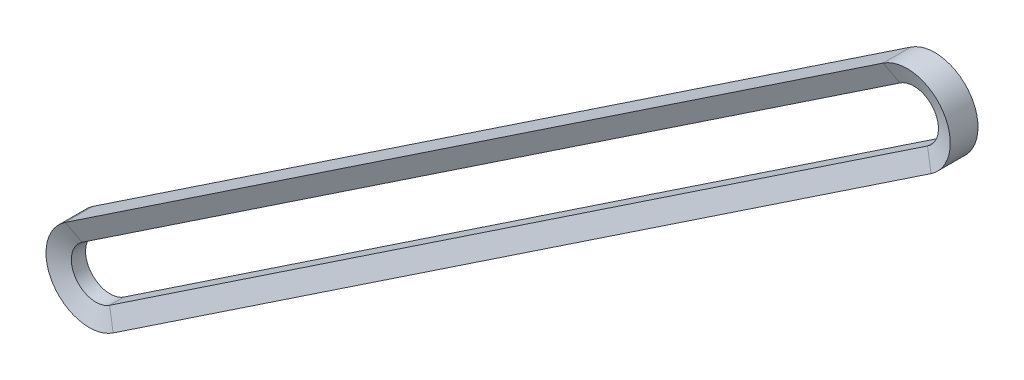
ISO-10303-21;
HEADER;
FILE_DESCRIPTION(('STEP AP214'),'2;1');
FILE_NAME('part.step','',(''),(''),'','','');
FILE_SCHEMA(('AUTOMOTIVE_DESIGN { 1 0 10303 214 1 1 1 1 }'));
ENDSEC;
DATA;
#1=APPLICATION_CONTEXT('core data for automotive mechanical design processes');
#2=APPLICATION_PROTOCOL_DEFINITION('international standard','automotive_design',2000,#1);
#3=PRODUCT_CONTEXT('',#1,'mechanical');
#4=PRODUCT('Part','Part','',(#3));
#5=PRODUCT_RELATED_PRODUCT_CATEGORY('part','',(#4));
#6=PRODUCT_DEFINITION_FORMATION('','',#4);
#7=PRODUCT_DEFINITION_CONTEXT('part definition',#1,'design');
#8=PRODUCT_DEFINITION('design','',#6,#7);
#9=PRODUCT_DEFINITION_SHAPE('','',#8);
#10=(LENGTH_UNIT() NAMED_UNIT(*) SI_UNIT(.MILLI.,.METRE.));
#11=(NAMED_UNIT(*) PLANE_ANGLE_UNIT() SI_UNIT($,.RADIAN.));
#12=(NAMED_UNIT(*) SI_UNIT($,.STERADIAN.) SOLID_ANGLE_UNIT());
#13=UNCERTAINTY_MEASURE_WITH_UNIT(LENGTH_MEASURE(1.E-05),#10,'distance_accuracy_value','');
#14=(GEOMETRIC_REPRESENTATION_CONTEXT(3) GLOBAL_UNCERTAINTY_ASSIGNED_CONTEXT((#13)) GLOBAL_UNIT_ASSIGNED_CONTEXT((#10,
#11,#12)) REPRESENTATION_CONTEXT('',''));
#15=CARTESIAN_POINT('',(0.,0.,0.));
#16=DIRECTION('',(0.,0.,1.));
#17=DIRECTION('',(1.,0.,0.));
#18=AXIS2_PLACEMENT_3D('',#15,#16,#17);
#19=CARTESIAN_POINT('',(6.63168225572308,4.4345393959262,0.));
#20=DIRECTION('',(0.,0.,1.));
#21=DIRECTION('',(1.,0.,0.));
#22=AXIS2_PLACEMENT_3D('',#19,#20,#21);
#23=CYLINDRICAL_SURFACE('',#22,5.3);
#24=CARTESIAN_POINT('',(6.63168225572308,4.4345393959262,-1.535));
#25=DIRECTION('',(0.,0.,1.));
#26=DIRECTION('',(0.555864056622764,-0.831273210536034,0.));
#27=AXIS2_PLACEMENT_3D('',#24,#25,#26);
#28=CIRCLE('',#27,5.3);
#29=CARTESIAN_POINT('',(9.57776175582378,0.0287913800852552,-1.535));
#30=VERTEX_POINT('',#29);
#31=CARTESIAN_POINT('',(3.68560275562248,8.84028741176721,-1.535));
#32=VERTEX_POINT('',#31);
#33=EDGE_CURVE('E11',#30,#32,#28,.T.);
#34=ORIENTED_EDGE('',*,*,#33,.F.);
#35=DIRECTION('',(0.,0.,-1.));
#36=VECTOR('',#35,1.);
#37=CARTESIAN_POINT('',(9.57776175582373,0.0287913800852135,1.535));
#38=LINE('',#37,#36);
#39=CARTESIAN_POINT('',(9.57776175582378,0.0287913800852552,1.535));
#40=VERTEX_POINT('',#39);
#41=EDGE_CURVE('E44',#30,#40,#38,.F.);
#42=ORIENTED_EDGE('',*,*,#41,.T.);
#43=CARTESIAN_POINT('',(6.63168225572308,4.4345393959262,1.535));
#44=DIRECTION('',(0.,0.,1.));
#45=DIRECTION('',(0.555864056622764,-0.831273210536034,0.));
#46=AXIS2_PLACEMENT_3D('',#43,#44,#45);
#47=CIRCLE('',#46,5.3);
#48=CARTESIAN_POINT('',(3.68560275562248,8.84028741176721,1.535));
#49=VERTEX_POINT('',#48);
#50=EDGE_CURVE('E129',#40,#49,#47,.T.);
#51=ORIENTED_EDGE('',*,*,#50,.T.);
#52=DIRECTION('',(0.,0.,-1.));
#53=VECTOR('',#52,1.);
#54=CARTESIAN_POINT('',(3.68560275562248,8.84028741176721,1.535));
#55=LINE('',#54,#53);
#56=EDGE_CURVE('E132',#32,#49,#55,.F.);
#57=ORIENTED_EDGE('',*,*,#56,.F.);
#58=EDGE_LOOP('',(#34,#42,#51,#57));
#59=FACE_BOUND('',#58,.T.);
#60=ADVANCED_FACE('F41',(#59),#23,.F.);
#61=CARTESIAN_POINT('',(6.63168225572308,4.4345393959262,-2.9908809370648));
#62=DIRECTION('',(0.,0.,-1.));
#63=DIRECTION('',(-1.,0.,0.));
#64=AXIS2_PLACEMENT_3D('',#61,#62,#63);
#65=CONICAL_SURFACE('',#64,9.30000000000001,1.22173047639603);
#66=CARTESIAN_POINT('',(6.63168225572308,4.4345393959262,-2.9908809370648));
#67=DIRECTION('',(0.,0.,1.));
#68=DIRECTION('',(0.555864056622758,-0.831273210536038,0.));
#69=AXIS2_PLACEMENT_3D('',#66,#67,#68);
#70=CIRCLE('',#69,9.30000000000001);
#71=CARTESIAN_POINT('',(11.8012179823148,-3.29630146205892,-2.9908809370648));
#72=VERTEX_POINT('',#71);
#73=CARTESIAN_POINT('',(1.46214652913148,12.1653802539114,-2.9908809370648));
#74=VERTEX_POINT('',#73);
#75=EDGE_CURVE('E49',#72,#74,#70,.T.);
#76=ORIENTED_EDGE('',*,*,#75,.F.);
#77=DIRECTION('',(0.52234135216852,-0.781141301797731,-0.342020143325666));
#78=VECTOR('',#77,1.);
#79=CARTESIAN_POINT('',(9.57776175582373,0.0287913800852135,-1.535));
#80=LINE('',#79,#78);
#81=EDGE_CURVE('E199',#72,#30,#80,.F.);
#82=ORIENTED_EDGE('',*,*,#81,.T.);
#83=ORIENTED_EDGE('',*,*,#33,.T.);
#84=DIRECTION('',(-0.52234135216852,0.781141301797731,-0.342020143325666));
#85=VECTOR('',#84,1.);
#86=CARTESIAN_POINT('',(3.68560275562248,8.84028741176721,-1.535));
#87=LINE('',#86,#85);
#88=EDGE_CURVE('E157',#74,#32,#87,.F.);
#89=ORIENTED_EDGE('',*,*,#88,.F.);
#90=EDGE_LOOP('',(#76,#82,#83,#89));
#91=FACE_BOUND('',#90,.T.);
#92=ADVANCED_FACE('F223',(#91),#65,.F.);
#93=CARTESIAN_POINT('',(6.63168225572308,4.4345393959262,0.));
#94=DIRECTION('',(0.,0.,1.));
#95=DIRECTION('',(1.,0.,0.));
#96=AXIS2_PLACEMENT_3D('',#93,#94,#95);
#97=CYLINDRICAL_SURFACE('',#96,9.30000000000001);
#98=CARTESIAN_POINT('',(6.63168225572308,4.4345393959262,2.9908809370648));
#99=DIRECTION('',(0.,0.,1.));
#100=DIRECTION('',(0.555864056622758,-0.831273210536038,0.));
#101=AXIS2_PLACEMENT_3D('',#98,#99,#100);
#102=CIRCLE('',#101,9.30000000000001);
#103=CARTESIAN_POINT('',(11.8012179823148,-3.29630146205892,2.9908809370648));
#104=VERTEX_POINT('',#103);
#105=CARTESIAN_POINT('',(1.46214652913148,12.1653802539114,2.9908809370648));
#106=VERTEX_POINT('',#105);
#107=EDGE_CURVE('E138',#104,#106,#102,.T.);
#108=ORIENTED_EDGE('',*,*,#107,.F.);
#109=DIRECTION('',(0.,0.,1.));
#110=VECTOR('',#109,1.);
#111=CARTESIAN_POINT('',(11.8012179823147,-3.29630146205896,-2.9908809370648));
#112=LINE('',#111,#110);
#113=EDGE_CURVE('E183',#104,#72,#112,.F.);
#114=ORIENTED_EDGE('',*,*,#113,.T.);
#115=ORIENTED_EDGE('',*,*,#75,.T.);
#116=DIRECTION('',(0.,0.,1.));
#117=VECTOR('',#116,1.);
#118=CARTESIAN_POINT('',(1.46214652913148,12.1653802539114,-2.9908809370648));
#119=LINE('',#118,#117);
#120=EDGE_CURVE('E161',#106,#74,#119,.F.);
#121=ORIENTED_EDGE('',*,*,#120,.F.);
#122=EDGE_LOOP('',(#108,#114,#115,#121));
#123=FACE_BOUND('',#122,.T.);
#124=ADVANCED_FACE('F228',(#123),#97,.T.);
#125=CARTESIAN_POINT('',(-166.649552907557,-117.812646037767,1.535));
#126=DIRECTION('',(-0.555864056622747,0.831273210536045,0.));
#127=DIRECTION('',(-0.831273210536045,-0.555864056622747,0.));
#128=AXIS2_PLACEMENT_3D('',#125,#126,#127);
#129=PLANE('',#128);
#130=ORIENTED_EDGE('',*,*,#41,.F.);
#131=DIRECTION('',(0.831273210536045,0.555864056622747,0.));
#132=VECTOR('',#131,1.);
#133=CARTESIAN_POINT('',(-166.649552907557,-117.812646037767,-1.535));
#134=LINE('',#133,#132);
#135=CARTESIAN_POINT('',(-166.649552907557,-117.812646037767,-1.535));
#136=VERTEX_POINT('',#135);
#137=EDGE_CURVE('E85',#136,#30,#134,.T.);
#138=ORIENTED_EDGE('',*,*,#137,.F.);
#139=DIRECTION('',(0.,0.,-1.));
#140=VECTOR('',#139,1.);
#141=CARTESIAN_POINT('',(-166.649552907557,-117.812646037767,1.535));
#142=LINE('',#141,#140);
#143=CARTESIAN_POINT('',(-166.649552907557,-117.812646037767,1.535));
#144=VERTEX_POINT('',#143);
#145=EDGE_CURVE('E186',#136,#144,#142,.F.);
#146=ORIENTED_EDGE('',*,*,#145,.T.);
#147=DIRECTION('',(0.831273210536045,0.555864056622747,0.));
#148=VECTOR('',#147,1.);
#149=CARTESIAN_POINT('',(-166.649552907557,-117.812646037767,1.535));
#150=LINE('',#149,#148);
#151=EDGE_CURVE('E181',#144,#40,#150,.T.);
#152=ORIENTED_EDGE('',*,*,#151,.T.);
#153=EDGE_LOOP('',(#130,#138,#146,#152));
#154=FACE_BOUND('',#153,.T.);
#155=ADVANCED_FACE('F212',(#154),#129,.T.);
#156=CARTESIAN_POINT('',(-166.649552907557,-117.812646037767,-1.535));
#157=DIRECTION('',(-0.190116704315698,0.284312182610325,-0.939692620785909));
#158=DIRECTION('',(0.,0.957149595706336,0.289593942338574));
#159=AXIS2_PLACEMENT_3D('',#156,#157,#158);
#160=PLANE('',#159);
#161=ORIENTED_EDGE('',*,*,#137,.T.);
#162=ORIENTED_EDGE('',*,*,#81,.F.);
#163=DIRECTION('',(0.831273210536045,0.555864056622747,0.));
#164=VECTOR('',#163,1.);
#165=CARTESIAN_POINT('',(-164.426096681066,-121.137738879911,-2.9908809370648));
#166=LINE('',#165,#164);
#167=CARTESIAN_POINT('',(-164.426096681066,-121.137738879911,-2.9908809370648));
#168=VERTEX_POINT('',#167);
#169=EDGE_CURVE('E94',#168,#72,#166,.T.);
#170=ORIENTED_EDGE('',*,*,#169,.F.);
#171=DIRECTION('',(0.52234135216852,-0.78114130179773,-0.342020143325666));
#172=VECTOR('',#171,1.);
#173=CARTESIAN_POINT('',(-166.649552907557,-117.812646037767,-1.535));
#174=LINE('',#173,#172);
#175=EDGE_CURVE('E195',#168,#136,#174,.F.);
#176=ORIENTED_EDGE('',*,*,#175,.T.);
#177=EDGE_LOOP('',(#161,#162,#170,#176));
#178=FACE_BOUND('',#177,.T.);
#179=ADVANCED_FACE('F222',(#178),#160,.T.);
#180=CARTESIAN_POINT('',(-164.426096681066,-121.137738879911,-2.9908809370648));
#181=DIRECTION('',(0.555864056622747,-0.831273210536045,0.));
#182=DIRECTION('',(0.831273210536045,0.555864056622747,0.));
#183=AXIS2_PLACEMENT_3D('',#180,#181,#182);
#184=PLANE('',#183);
#185=ORIENTED_EDGE('',*,*,#169,.T.);
#186=ORIENTED_EDGE('',*,*,#113,.F.);
#187=DIRECTION('',(0.831273210536045,0.555864056622747,0.));
#188=VECTOR('',#187,1.);
#189=CARTESIAN_POINT('',(-164.426096681066,-121.137738879911,2.9908809370648));
#190=LINE('',#189,#188);
#191=CARTESIAN_POINT('',(-164.426096681066,-121.137738879911,2.9908809370648));
#192=VERTEX_POINT('',#191);
#193=EDGE_CURVE('E102',#192,#104,#190,.T.);
#194=ORIENTED_EDGE('',*,*,#193,.F.);
#195=DIRECTION('',(0.,0.,1.));
#196=VECTOR('',#195,1.);
#197=CARTESIAN_POINT('',(-164.426096681066,-121.137738879911,-2.9908809370648));
#198=LINE('',#197,#196);
#199=EDGE_CURVE('E175',#192,#168,#198,.F.);
#200=ORIENTED_EDGE('',*,*,#199,.T.);
#201=EDGE_LOOP('',(#185,#186,#194,#200));
#202=FACE_BOUND('',#201,.T.);
#203=ADVANCED_FACE('F229',(#202),#184,.T.);
#204=CARTESIAN_POINT('',(-166.649552907557,-117.812646037767,1.535));
#205=DIRECTION('',(-0.190116704315698,0.284312182610325,0.939692620785909));
#206=DIRECTION('',(0.,-0.957149595706336,0.289593942338574));
#207=AXIS2_PLACEMENT_3D('',#204,#205,#206);
#208=PLANE('',#207);
#209=ORIENTED_EDGE('',*,*,#193,.T.);
#210=DIRECTION('',(0.52234135216852,-0.781141301797731,0.342020143325666));
#211=VECTOR('',#210,1.);
#212=CARTESIAN_POINT('',(9.57776175582373,0.0287913800852135,1.535));
#213=LINE('',#212,#211);
#214=EDGE_CURVE('E179',#40,#104,#213,.T.);
#215=ORIENTED_EDGE('',*,*,#214,.F.);
#216=ORIENTED_EDGE('',*,*,#151,.F.);
#217=DIRECTION('',(0.52234135216852,-0.78114130179773,0.342020143325666));
#218=VECTOR('',#217,1.);
#219=CARTESIAN_POINT('',(-166.649552907557,-117.812646037767,1.535));
#220=LINE('',#219,#218);
#221=EDGE_CURVE('E170',#144,#192,#220,.T.);
#222=ORIENTED_EDGE('',*,*,#221,.T.);
#223=EDGE_LOOP('',(#209,#215,#216,#222));
#224=FACE_BOUND('',#223,.T.);
#225=ADVANCED_FACE('F230',(#224),#208,.T.);
#226=CARTESIAN_POINT('',(-169.595632407658,-113.406898021926,0.));
#227=DIRECTION('',(0.,0.,1.));
#228=DIRECTION('',(1.,0.,0.));
#229=AXIS2_PLACEMENT_3D('',#226,#227,#228);
#230=CYLINDRICAL_SURFACE('',#229,5.3);
#231=ORIENTED_EDGE('',*,*,#145,.F.);
#232=CARTESIAN_POINT('',(-169.595632407658,-113.406898021926,-1.535));
#233=DIRECTION('',(0.,0.,1.));
#234=DIRECTION('',(-0.555864056622763,0.831273210536034,0.));
#235=AXIS2_PLACEMENT_3D('',#232,#233,#234);
#236=CIRCLE('',#235,5.3);
#237=CARTESIAN_POINT('',(-172.541711907758,-109.001150006085,-1.535));
#238=VERTEX_POINT('',#237);
#239=EDGE_CURVE('E205',#238,#136,#236,.T.);
#240=ORIENTED_EDGE('',*,*,#239,.F.);
#241=DIRECTION('',(0.,0.,-1.));
#242=VECTOR('',#241,1.);
#243=CARTESIAN_POINT('',(-172.541711907758,-109.001150006085,1.535));
#244=LINE('',#243,#242);
#245=CARTESIAN_POINT('',(-172.541711907758,-109.001150006085,1.535));
#246=VERTEX_POINT('',#245);
#247=EDGE_CURVE('E178',#238,#246,#244,.F.);
#248=ORIENTED_EDGE('',*,*,#247,.T.);
#249=CARTESIAN_POINT('',(-169.595632407658,-113.406898021926,1.535));
#250=DIRECTION('',(0.,0.,1.));
#251=DIRECTION('',(-0.555864056622763,0.831273210536034,0.));
#252=AXIS2_PLACEMENT_3D('',#249,#250,#251);
#253=CIRCLE('',#252,5.3);
#254=EDGE_CURVE('E173',#246,#144,#253,.T.);
#255=ORIENTED_EDGE('',*,*,#254,.T.);
#256=EDGE_LOOP('',(#231,#240,#248,#255));
#257=FACE_BOUND('',#256,.T.);
#258=ADVANCED_FACE('F217',(#257),#230,.F.);
#259=CARTESIAN_POINT('',(-169.595632407658,-113.406898021926,-2.9908809370648));
#260=DIRECTION('',(0.,0.,-1.));
#261=DIRECTION('',(-1.,0.,0.));
#262=AXIS2_PLACEMENT_3D('',#259,#260,#261);
#263=CONICAL_SURFACE('',#262,9.30000000000001,1.22173047639603);
#264=ORIENTED_EDGE('',*,*,#239,.T.);
#265=ORIENTED_EDGE('',*,*,#175,.F.);
#266=CARTESIAN_POINT('',(-169.595632407658,-113.406898021926,-2.9908809370648));
#267=DIRECTION('',(0.,0.,1.));
#268=DIRECTION('',(-0.555864056622758,0.831273210536038,0.));
#269=AXIS2_PLACEMENT_3D('',#266,#267,#268);
#270=CIRCLE('',#269,9.30000000000001);
#271=CARTESIAN_POINT('',(-174.765168134249,-105.676057163941,-2.9908809370648));
#272=VERTEX_POINT('',#271);
#273=EDGE_CURVE('E114',#272,#168,#270,.T.);
#274=ORIENTED_EDGE('',*,*,#273,.F.);
#275=DIRECTION('',(-0.52234135216852,0.781141301797731,-0.342020143325666));
#276=VECTOR('',#275,1.);
#277=CARTESIAN_POINT('',(-172.541711907758,-109.001150006085,-1.535));
#278=LINE('',#277,#276);
#279=EDGE_CURVE('E192',#272,#238,#278,.F.);
#280=ORIENTED_EDGE('',*,*,#279,.T.);
#281=EDGE_LOOP('',(#264,#265,#274,#280));
#282=FACE_BOUND('',#281,.T.);
#283=ADVANCED_FACE('F221',(#282),#263,.F.);
#284=CARTESIAN_POINT('',(-169.595632407658,-113.406898021926,0.));
#285=DIRECTION('',(0.,0.,1.));
#286=DIRECTION('',(1.,0.,0.));
#287=AXIS2_PLACEMENT_3D('',#284,#285,#286);
#288=CYLINDRICAL_SURFACE('',#287,9.30000000000001);
#289=ORIENTED_EDGE('',*,*,#273,.T.);
#290=ORIENTED_EDGE('',*,*,#199,.F.);
#291=CARTESIAN_POINT('',(-169.595632407658,-113.406898021926,2.9908809370648));
#292=DIRECTION('',(0.,0.,1.));
#293=DIRECTION('',(-0.555864056622758,0.831273210536038,0.));
#294=AXIS2_PLACEMENT_3D('',#291,#292,#293);
#295=CIRCLE('',#294,9.30000000000001);
#296=CARTESIAN_POINT('',(-174.765168134249,-105.676057163941,2.9908809370648));
#297=VERTEX_POINT('',#296);
#298=EDGE_CURVE('E120',#297,#192,#295,.T.);
#299=ORIENTED_EDGE('',*,*,#298,.F.);
#300=DIRECTION('',(0.,0.,1.));
#301=VECTOR('',#300,1.);
#302=CARTESIAN_POINT('',(-174.765168134249,-105.676057163941,-2.9908809370648));
#303=LINE('',#302,#301);
#304=EDGE_CURVE('E168',#297,#272,#303,.F.);
#305=ORIENTED_EDGE('',*,*,#304,.T.);
#306=EDGE_LOOP('',(#289,#290,#299,#305));
#307=FACE_BOUND('',#306,.T.);
#308=ADVANCED_FACE('F286',(#307),#288,.T.);
#309=CARTESIAN_POINT('',(-169.595632407658,-113.406898021926,1.535));
#310=DIRECTION('',(0.,0.,1.));
#311=DIRECTION('',(1.,0.,0.));
#312=AXIS2_PLACEMENT_3D('',#309,#310,#311);
#313=CONICAL_SURFACE('',#312,5.3,1.22173047639603);
#314=ORIENTED_EDGE('',*,*,#298,.T.);
#315=ORIENTED_EDGE('',*,*,#221,.F.);
#316=ORIENTED_EDGE('',*,*,#254,.F.);
#317=DIRECTION('',(-0.52234135216852,0.781141301797731,0.342020143325666));
#318=VECTOR('',#317,1.);
#319=CARTESIAN_POINT('',(-172.541711907758,-109.001150006085,1.535));
#320=LINE('',#319,#318);
#321=EDGE_CURVE('E149',#246,#297,#320,.T.);
#322=ORIENTED_EDGE('',*,*,#321,.T.);
#323=EDGE_LOOP('',(#314,#315,#316,#322));
#324=FACE_BOUND('',#323,.T.);
#325=ADVANCED_FACE('F215',(#324),#313,.F.);
#326=CARTESIAN_POINT('',(3.68560275562248,8.84028741176721,1.535));
#327=DIRECTION('',(0.555864056622747,-0.831273210536045,0.));
#328=DIRECTION('',(0.831273210536045,0.555864056622747,0.));
#329=AXIS2_PLACEMENT_3D('',#326,#327,#328);
#330=PLANE('',#329);
#331=ORIENTED_EDGE('',*,*,#247,.F.);
#332=DIRECTION('',(-0.831273210536045,-0.555864056622747,0.));
#333=VECTOR('',#332,1.);
#334=CARTESIAN_POINT('',(3.68560275562248,8.84028741176721,-1.535));
#335=LINE('',#334,#333);
#336=EDGE_CURVE('E156',#32,#238,#335,.T.);
#337=ORIENTED_EDGE('',*,*,#336,.F.);
#338=ORIENTED_EDGE('',*,*,#56,.T.);
#339=DIRECTION('',(-0.831273210536045,-0.555864056622747,0.));
#340=VECTOR('',#339,1.);
#341=CARTESIAN_POINT('',(3.68560275562248,8.84028741176721,1.535));
#342=LINE('',#341,#340);
#343=EDGE_CURVE('E144',#49,#246,#342,.T.);
#344=ORIENTED_EDGE('',*,*,#343,.T.);
#345=EDGE_LOOP('',(#331,#337,#338,#344));
#346=FACE_BOUND('',#345,.T.);
#347=ADVANCED_FACE('F154',(#346),#330,.T.);
#348=CARTESIAN_POINT('',(3.68560275562248,8.84028741176721,-1.535));
#349=DIRECTION('',(0.190116704315698,-0.284312182610325,-0.939692620785909));
#350=DIRECTION('',(0.,0.957149595706336,-0.289593942338574));
#351=AXIS2_PLACEMENT_3D('',#348,#349,#350);
#352=PLANE('',#351);
#353=ORIENTED_EDGE('',*,*,#336,.T.);
#354=ORIENTED_EDGE('',*,*,#279,.F.);
#355=DIRECTION('',(-0.831273210536045,-0.555864056622747,0.));
#356=VECTOR('',#355,1.);
#357=CARTESIAN_POINT('',(1.46214652913148,12.1653802539114,-2.9908809370648));
#358=LINE('',#357,#356);
#359=EDGE_CURVE('E189',#74,#272,#358,.T.);
#360=ORIENTED_EDGE('',*,*,#359,.F.);
#361=ORIENTED_EDGE('',*,*,#88,.T.);
#362=EDGE_LOOP('',(#353,#354,#360,#361));
#363=FACE_BOUND('',#362,.T.);
#364=ADVANCED_FACE('F219',(#363),#352,.T.);
#365=CARTESIAN_POINT('',(1.46214652913148,12.1653802539114,-2.9908809370648));
#366=DIRECTION('',(-0.555864056622747,0.831273210536045,0.));
#367=DIRECTION('',(-0.831273210536045,-0.555864056622747,0.));
#368=AXIS2_PLACEMENT_3D('',#365,#366,#367);
#369=PLANE('',#368);
#370=ORIENTED_EDGE('',*,*,#359,.T.);
#371=ORIENTED_EDGE('',*,*,#304,.F.);
#372=DIRECTION('',(-0.831273210536045,-0.555864056622747,0.));
#373=VECTOR('',#372,1.);
#374=CARTESIAN_POINT('',(1.46214652913148,12.1653802539114,2.9908809370648));
#375=LINE('',#374,#373);
#376=EDGE_CURVE('E167',#106,#297,#375,.T.);
#377=ORIENTED_EDGE('',*,*,#376,.F.);
#378=ORIENTED_EDGE('',*,*,#120,.T.);
#379=EDGE_LOOP('',(#370,#371,#377,#378));
#380=FACE_BOUND('',#379,.T.);
#381=ADVANCED_FACE('F226',(#380),#369,.T.);
#382=CARTESIAN_POINT('',(3.68560275562248,8.84028741176721,1.535));
#383=DIRECTION('',(0.190116704315698,-0.284312182610325,0.939692620785909));
#384=DIRECTION('',(0.,-0.957149595706336,-0.289593942338574));
#385=AXIS2_PLACEMENT_3D('',#382,#383,#384);
#386=PLANE('',#385);
#387=ORIENTED_EDGE('',*,*,#376,.T.);
#388=ORIENTED_EDGE('',*,*,#321,.F.);
#389=ORIENTED_EDGE('',*,*,#343,.F.);
#390=DIRECTION('',(-0.52234135216852,0.781141301797731,0.342020143325666));
#391=VECTOR('',#390,1.);
#392=CARTESIAN_POINT('',(3.68560275562248,8.84028741176721,1.535));
#393=LINE('',#392,#391);
#394=EDGE_CURVE('E147',#49,#106,#393,.T.);
#395=ORIENTED_EDGE('',*,*,#394,.T.);
#396=EDGE_LOOP('',(#387,#388,#389,#395));
#397=FACE_BOUND('',#396,.T.);
#398=ADVANCED_FACE('F146',(#397),#386,.T.);
#399=CARTESIAN_POINT('',(6.63168225572308,4.4345393959262,1.535));
#400=DIRECTION('',(0.,0.,1.));
#401=DIRECTION('',(1.,0.,0.));
#402=AXIS2_PLACEMENT_3D('',#399,#400,#401);
#403=CONICAL_SURFACE('',#402,5.3,1.22173047639603);
#404=ORIENTED_EDGE('',*,*,#214,.T.);
#405=ORIENTED_EDGE('',*,*,#107,.T.);
#406=ORIENTED_EDGE('',*,*,#394,.F.);
#407=ORIENTED_EDGE('',*,*,#50,.F.);
#408=EDGE_LOOP('',(#404,#405,#406,#407));
#409=FACE_BOUND('',#408,.T.);
#410=ADVANCED_FACE('F159',(#409),#403,.F.);
#411=CLOSED_SHELL('',(#60,#92,#124,#155,#179,#203,#225,#258,#283,#308,#325,#347,#364,#381,#398,#410));
#412=MANIFOLD_SOLID_BREP('B2',#411);
#413=ADVANCED_BREP_SHAPE_REPRESENTATION('',(#18,#412),#14);
#414=SHAPE_DEFINITION_REPRESENTATION(#9,#413);
ENDSEC;
END-ISO-10303-21;
